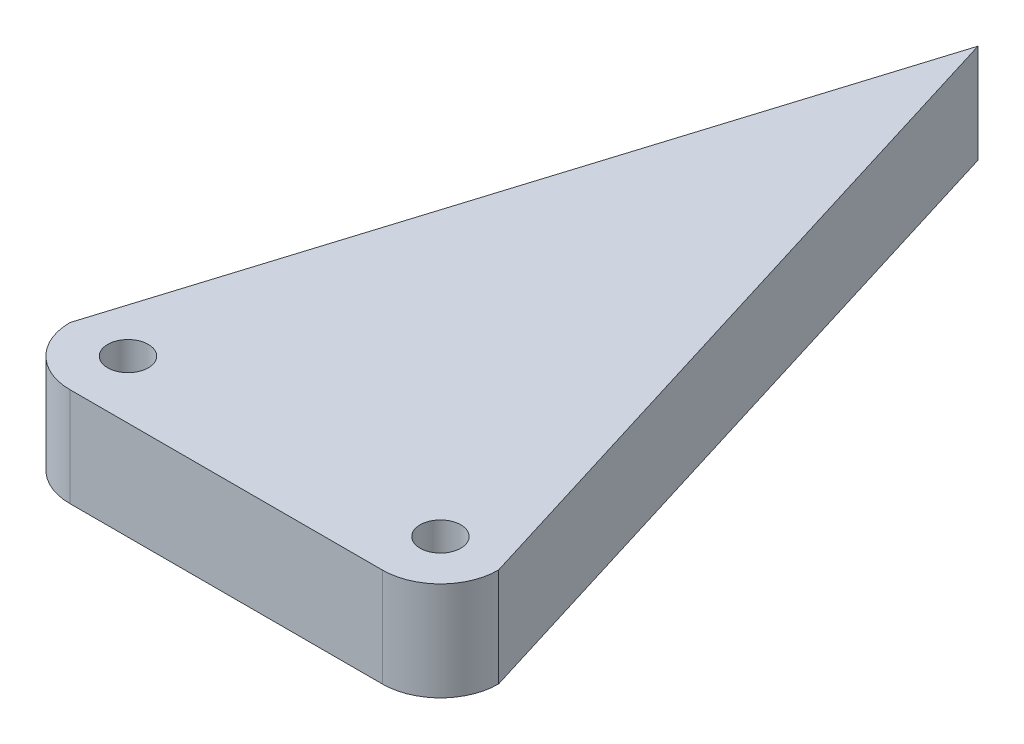
ISO-10303-21;
HEADER;
FILE_DESCRIPTION(('STEP AP214'),'2;1');
FILE_NAME('part.step','',(''),(''),'','','');
FILE_SCHEMA(('AUTOMOTIVE_DESIGN { 1 0 10303 214 1 1 1 1 }'));
ENDSEC;
DATA;
#1=APPLICATION_CONTEXT('core data for automotive mechanical design processes');
#2=APPLICATION_PROTOCOL_DEFINITION('international standard','automotive_design',2000,#1);
#3=PRODUCT_CONTEXT('',#1,'mechanical');
#4=PRODUCT('Part','Part','',(#3));
#5=PRODUCT_RELATED_PRODUCT_CATEGORY('part','',(#4));
#6=PRODUCT_DEFINITION_FORMATION('','',#4);
#7=PRODUCT_DEFINITION_CONTEXT('part definition',#1,'design');
#8=PRODUCT_DEFINITION('design','',#6,#7);
#9=PRODUCT_DEFINITION_SHAPE('','',#8);
#10=(LENGTH_UNIT() NAMED_UNIT(*) SI_UNIT(.MILLI.,.METRE.));
#11=(NAMED_UNIT(*) PLANE_ANGLE_UNIT() SI_UNIT($,.RADIAN.));
#12=(NAMED_UNIT(*) SI_UNIT($,.STERADIAN.) SOLID_ANGLE_UNIT());
#13=UNCERTAINTY_MEASURE_WITH_UNIT(LENGTH_MEASURE(1.E-05),#10,'distance_accuracy_value','');
#14=(GEOMETRIC_REPRESENTATION_CONTEXT(3) GLOBAL_UNCERTAINTY_ASSIGNED_CONTEXT((#13)) GLOBAL_UNIT_ASSIGNED_CONTEXT((#10,
#11,#12)) REPRESENTATION_CONTEXT('',''));
#15=CARTESIAN_POINT('',(0.,0.,0.));
#16=DIRECTION('',(0.,0.,1.));
#17=DIRECTION('',(1.,0.,0.));
#18=AXIS2_PLACEMENT_3D('',#15,#16,#17);
#19=CARTESIAN_POINT('',(26.9,8.5,0.));
#20=DIRECTION('',(0.,1.,0.));
#21=DIRECTION('',(0.,0.,1.));
#22=AXIS2_PLACEMENT_3D('',#19,#20,#21);
#23=PLANE('',#22);
#24=CARTESIAN_POINT('',(0.,8.5,0.));
#25=DIRECTION('',(0.,1.,0.));
#26=DIRECTION('',(0.,0.,1.));
#27=AXIS2_PLACEMENT_3D('',#24,#25,#26);
#28=CIRCLE('',#27,1.75);
#29=CARTESIAN_POINT('',(0.,8.5,1.75));
#30=VERTEX_POINT('',#29);
#31=EDGE_CURVE('E115',#30,#30,#28,.T.);
#32=ORIENTED_EDGE('',*,*,#31,.F.);
#33=EDGE_LOOP('',(#32));
#34=FACE_BOUND('',#33,.T.);
#35=DIRECTION('',(-0.294844329924266,0.,-0.955545300397376));
#36=VECTOR('',#35,1.);
#37=CARTESIAN_POINT('',(13.4798064327938,8.5,-59.6970252067422));
#38=LINE('',#37,#36);
#39=CARTESIAN_POINT('',(31.9,8.5,0.));
#40=VERTEX_POINT('',#39);
#41=CARTESIAN_POINT('',(13.4798064327938,8.5,-59.6970252067422));
#42=VERTEX_POINT('',#41);
#43=EDGE_CURVE('E120',#40,#42,#38,.T.);
#44=ORIENTED_EDGE('',*,*,#43,.T.);
#45=DIRECTION('',(-0.295715208736061,0.,0.9552761461076));
#46=VECTOR('',#45,1.);
#47=CARTESIAN_POINT('',(-5.,8.5,0.));
#48=LINE('',#47,#46);
#49=CARTESIAN_POINT('',(-5.,8.5,0.));
#50=VERTEX_POINT('',#49);
#51=EDGE_CURVE('E87',#42,#50,#48,.T.);
#52=ORIENTED_EDGE('',*,*,#51,.T.);
#53=CARTESIAN_POINT('',(0.,8.5,0.));
#54=DIRECTION('',(0.,1.,0.));
#55=DIRECTION('',(0.,0.,1.));
#56=AXIS2_PLACEMENT_3D('',#53,#54,#55);
#57=CIRCLE('',#56,5.);
#58=CARTESIAN_POINT('',(0.,8.5,5.));
#59=VERTEX_POINT('',#58);
#60=EDGE_CURVE('E91',#50,#59,#57,.T.);
#61=ORIENTED_EDGE('',*,*,#60,.T.);
#62=DIRECTION('',(1.,0.,0.));
#63=VECTOR('',#62,1.);
#64=CARTESIAN_POINT('',(0.,8.5,5.));
#65=LINE('',#64,#63);
#66=CARTESIAN_POINT('',(26.9,8.5,5.));
#67=VERTEX_POINT('',#66);
#68=EDGE_CURVE('E95',#59,#67,#65,.T.);
#69=ORIENTED_EDGE('',*,*,#68,.T.);
#70=CARTESIAN_POINT('',(26.9,8.5,0.));
#71=DIRECTION('',(0.,1.,0.));
#72=DIRECTION('',(0.,0.,1.));
#73=AXIS2_PLACEMENT_3D('',#70,#71,#72);
#74=CIRCLE('',#73,5.);
#75=EDGE_CURVE('E53',#67,#40,#74,.T.);
#76=ORIENTED_EDGE('',*,*,#75,.T.);
#77=EDGE_LOOP('',(#44,#52,#61,#69,#76));
#78=FACE_BOUND('',#77,.T.);
#79=CARTESIAN_POINT('',(26.9,8.5,0.));
#80=DIRECTION('',(0.,1.,0.));
#81=DIRECTION('',(0.,0.,1.));
#82=AXIS2_PLACEMENT_3D('',#79,#80,#81);
#83=CIRCLE('',#82,1.75);
#84=CARTESIAN_POINT('',(26.9,8.5,1.75));
#85=VERTEX_POINT('',#84);
#86=EDGE_CURVE('E157',#85,#85,#83,.T.);
#87=ORIENTED_EDGE('',*,*,#86,.F.);
#88=EDGE_LOOP('',(#87));
#89=FACE_BOUND('',#88,.T.);
#90=ADVANCED_FACE('F36',(#34,#78,#89),#23,.T.);
#91=CARTESIAN_POINT('',(26.9,0.,0.));
#92=DIRECTION('',(0.,1.,0.));
#93=DIRECTION('',(0.,0.,1.));
#94=AXIS2_PLACEMENT_3D('',#91,#92,#93);
#95=PLANE('',#94);
#96=DIRECTION('',(-0.294844329924266,0.,-0.955545300397376));
#97=VECTOR('',#96,1.);
#98=CARTESIAN_POINT('',(13.4798064327938,0.,-59.6970252067422));
#99=LINE('',#98,#97);
#100=CARTESIAN_POINT('',(31.9,0.,0.));
#101=VERTEX_POINT('',#100);
#102=CARTESIAN_POINT('',(13.4798064327938,0.,-59.6970252067422));
#103=VERTEX_POINT('',#102);
#104=EDGE_CURVE('E111',#101,#103,#99,.T.);
#105=ORIENTED_EDGE('',*,*,#104,.F.);
#106=CARTESIAN_POINT('',(26.9,0.,0.));
#107=DIRECTION('',(0.,1.,0.));
#108=DIRECTION('',(0.,0.,1.));
#109=AXIS2_PLACEMENT_3D('',#106,#107,#108);
#110=CIRCLE('',#109,5.);
#111=CARTESIAN_POINT('',(26.9,0.,5.));
#112=VERTEX_POINT('',#111);
#113=EDGE_CURVE('E79',#112,#101,#110,.T.);
#114=ORIENTED_EDGE('',*,*,#113,.F.);
#115=DIRECTION('',(1.,0.,0.));
#116=VECTOR('',#115,1.);
#117=CARTESIAN_POINT('',(0.,0.,5.));
#118=LINE('',#117,#116);
#119=CARTESIAN_POINT('',(0.,0.,5.));
#120=VERTEX_POINT('',#119);
#121=EDGE_CURVE('E73',#120,#112,#118,.T.);
#122=ORIENTED_EDGE('',*,*,#121,.F.);
#123=CARTESIAN_POINT('',(0.,0.,0.));
#124=DIRECTION('',(0.,1.,0.));
#125=DIRECTION('',(0.,0.,1.));
#126=AXIS2_PLACEMENT_3D('',#123,#124,#125);
#127=CIRCLE('',#126,5.);
#128=CARTESIAN_POINT('',(-5.,0.,0.));
#129=VERTEX_POINT('',#128);
#130=EDGE_CURVE('E102',#129,#120,#127,.T.);
#131=ORIENTED_EDGE('',*,*,#130,.F.);
#132=DIRECTION('',(-0.295715208736061,0.,0.9552761461076));
#133=VECTOR('',#132,1.);
#134=CARTESIAN_POINT('',(-5.,0.,0.));
#135=LINE('',#134,#133);
#136=EDGE_CURVE('E114',#103,#129,#135,.T.);
#137=ORIENTED_EDGE('',*,*,#136,.F.);
#138=EDGE_LOOP('',(#105,#114,#122,#131,#137));
#139=FACE_BOUND('',#138,.T.);
#140=CARTESIAN_POINT('',(0.,0.,0.));
#141=DIRECTION('',(0.,1.,0.));
#142=DIRECTION('',(0.,0.,1.));
#143=AXIS2_PLACEMENT_3D('',#140,#141,#142);
#144=CIRCLE('',#143,1.75);
#145=CARTESIAN_POINT('',(0.,0.,1.75));
#146=VERTEX_POINT('',#145);
#147=EDGE_CURVE('E163',#146,#146,#144,.T.);
#148=ORIENTED_EDGE('',*,*,#147,.T.);
#149=EDGE_LOOP('',(#148));
#150=FACE_BOUND('',#149,.T.);
#151=CARTESIAN_POINT('',(26.9,0.,0.));
#152=DIRECTION('',(0.,1.,0.));
#153=DIRECTION('',(0.,0.,1.));
#154=AXIS2_PLACEMENT_3D('',#151,#152,#153);
#155=CIRCLE('',#154,1.75);
#156=CARTESIAN_POINT('',(26.9,0.,1.75));
#157=VERTEX_POINT('',#156);
#158=EDGE_CURVE('E160',#157,#157,#155,.T.);
#159=ORIENTED_EDGE('',*,*,#158,.T.);
#160=EDGE_LOOP('',(#159));
#161=FACE_BOUND('',#160,.T.);
#162=ADVANCED_FACE('F124',(#139,#150,#161),#95,.F.);
#163=CARTESIAN_POINT('',(13.4798064327938,8.5,-59.6970252067422));
#164=DIRECTION('',(-0.955545300397376,0.,0.294844329924266));
#165=DIRECTION('',(0.294844329924266,0.,0.955545300397376));
#166=AXIS2_PLACEMENT_3D('',#163,#164,#165);
#167=PLANE('',#166);
#168=ORIENTED_EDGE('',*,*,#104,.T.);
#169=DIRECTION('',(0.,-1.,0.));
#170=VECTOR('',#169,1.);
#171=CARTESIAN_POINT('',(13.4798064327938,8.5,-59.6970252067422));
#172=LINE('',#171,#170);
#173=EDGE_CURVE('E11',#42,#103,#172,.T.);
#174=ORIENTED_EDGE('',*,*,#173,.F.);
#175=ORIENTED_EDGE('',*,*,#43,.F.);
#176=DIRECTION('',(0.,-1.,0.));
#177=VECTOR('',#176,1.);
#178=CARTESIAN_POINT('',(31.9,8.5,0.));
#179=LINE('',#178,#177);
#180=EDGE_CURVE('E107',#40,#101,#179,.T.);
#181=ORIENTED_EDGE('',*,*,#180,.T.);
#182=EDGE_LOOP('',(#168,#174,#175,#181));
#183=FACE_BOUND('',#182,.T.);
#184=ADVANCED_FACE('F38',(#183),#167,.F.);
#185=CARTESIAN_POINT('',(-5.,8.5,0.));
#186=DIRECTION('',(0.9552761461076,0.,0.295715208736061));
#187=DIRECTION('',(0.295715208736061,0.,-0.9552761461076));
#188=AXIS2_PLACEMENT_3D('',#185,#186,#187);
#189=PLANE('',#188);
#190=ORIENTED_EDGE('',*,*,#136,.T.);
#191=DIRECTION('',(0.,-1.,0.));
#192=VECTOR('',#191,1.);
#193=CARTESIAN_POINT('',(-5.,8.5,0.));
#194=LINE('',#193,#192);
#195=EDGE_CURVE('E45',#50,#129,#194,.T.);
#196=ORIENTED_EDGE('',*,*,#195,.F.);
#197=ORIENTED_EDGE('',*,*,#51,.F.);
#198=ORIENTED_EDGE('',*,*,#173,.T.);
#199=EDGE_LOOP('',(#190,#196,#197,#198));
#200=FACE_BOUND('',#199,.T.);
#201=ADVANCED_FACE('F195',(#200),#189,.F.);
#202=CARTESIAN_POINT('',(0.,8.5,0.));
#203=DIRECTION('',(0.,-1.,0.));
#204=DIRECTION('',(0.,0.,-1.));
#205=AXIS2_PLACEMENT_3D('',#202,#203,#204);
#206=CYLINDRICAL_SURFACE('',#205,5.);
#207=ORIENTED_EDGE('',*,*,#130,.T.);
#208=DIRECTION('',(0.,-1.,0.));
#209=VECTOR('',#208,1.);
#210=CARTESIAN_POINT('',(0.,8.5,5.));
#211=LINE('',#210,#209);
#212=EDGE_CURVE('E99',#59,#120,#211,.T.);
#213=ORIENTED_EDGE('',*,*,#212,.F.);
#214=ORIENTED_EDGE('',*,*,#60,.F.);
#215=ORIENTED_EDGE('',*,*,#195,.T.);
#216=EDGE_LOOP('',(#207,#213,#214,#215));
#217=FACE_BOUND('',#216,.T.);
#218=ADVANCED_FACE('F100',(#217),#206,.T.);
#219=CARTESIAN_POINT('',(0.,8.5,5.));
#220=DIRECTION('',(0.,0.,-1.));
#221=DIRECTION('',(-1.,0.,0.));
#222=AXIS2_PLACEMENT_3D('',#219,#220,#221);
#223=PLANE('',#222);
#224=ORIENTED_EDGE('',*,*,#121,.T.);
#225=DIRECTION('',(0.,-1.,0.));
#226=VECTOR('',#225,1.);
#227=CARTESIAN_POINT('',(26.9,8.5,5.));
#228=LINE('',#227,#226);
#229=EDGE_CURVE('E103',#67,#112,#228,.T.);
#230=ORIENTED_EDGE('',*,*,#229,.F.);
#231=ORIENTED_EDGE('',*,*,#68,.F.);
#232=ORIENTED_EDGE('',*,*,#212,.T.);
#233=EDGE_LOOP('',(#224,#230,#231,#232));
#234=FACE_BOUND('',#233,.T.);
#235=ADVANCED_FACE('F105',(#234),#223,.F.);
#236=CARTESIAN_POINT('',(26.9,8.5,0.));
#237=DIRECTION('',(0.,-1.,0.));
#238=DIRECTION('',(0.,0.,-1.));
#239=AXIS2_PLACEMENT_3D('',#236,#237,#238);
#240=CYLINDRICAL_SURFACE('',#239,5.);
#241=ORIENTED_EDGE('',*,*,#113,.T.);
#242=ORIENTED_EDGE('',*,*,#180,.F.);
#243=ORIENTED_EDGE('',*,*,#75,.F.);
#244=ORIENTED_EDGE('',*,*,#229,.T.);
#245=EDGE_LOOP('',(#241,#242,#243,#244));
#246=FACE_BOUND('',#245,.T.);
#247=ADVANCED_FACE('F129',(#246),#240,.T.);
#248=CARTESIAN_POINT('',(0.,8.5,0.));
#249=DIRECTION('',(0.,-1.,0.));
#250=DIRECTION('',(0.,0.,-1.));
#251=AXIS2_PLACEMENT_3D('',#248,#249,#250);
#252=CYLINDRICAL_SURFACE('',#251,1.75);
#253=ORIENTED_EDGE('',*,*,#31,.T.);
#254=EDGE_LOOP('',(#253));
#255=FACE_BOUND('',#254,.T.);
#256=ORIENTED_EDGE('',*,*,#147,.F.);
#257=EDGE_LOOP('',(#256));
#258=FACE_BOUND('',#257,.T.);
#259=ADVANCED_FACE('F131',(#255,#258),#252,.F.);
#260=CARTESIAN_POINT('',(26.9,8.5,0.));
#261=DIRECTION('',(0.,-1.,0.));
#262=DIRECTION('',(0.,0.,-1.));
#263=AXIS2_PLACEMENT_3D('',#260,#261,#262);
#264=CYLINDRICAL_SURFACE('',#263,1.75);
#265=ORIENTED_EDGE('',*,*,#86,.T.);
#266=EDGE_LOOP('',(#265));
#267=FACE_BOUND('',#266,.T.);
#268=ORIENTED_EDGE('',*,*,#158,.F.);
#269=EDGE_LOOP('',(#268));
#270=FACE_BOUND('',#269,.T.);
#271=ADVANCED_FACE('F137',(#267,#270),#264,.F.);
#272=CLOSED_SHELL('',(#90,#162,#184,#201,#218,#235,#247,#259,#271));
#273=MANIFOLD_SOLID_BREP('B2',#272);
#274=ADVANCED_BREP_SHAPE_REPRESENTATION('',(#18,#273),#14);
#275=SHAPE_DEFINITION_REPRESENTATION(#9,#274);
ENDSEC;
END-ISO-10303-21;
